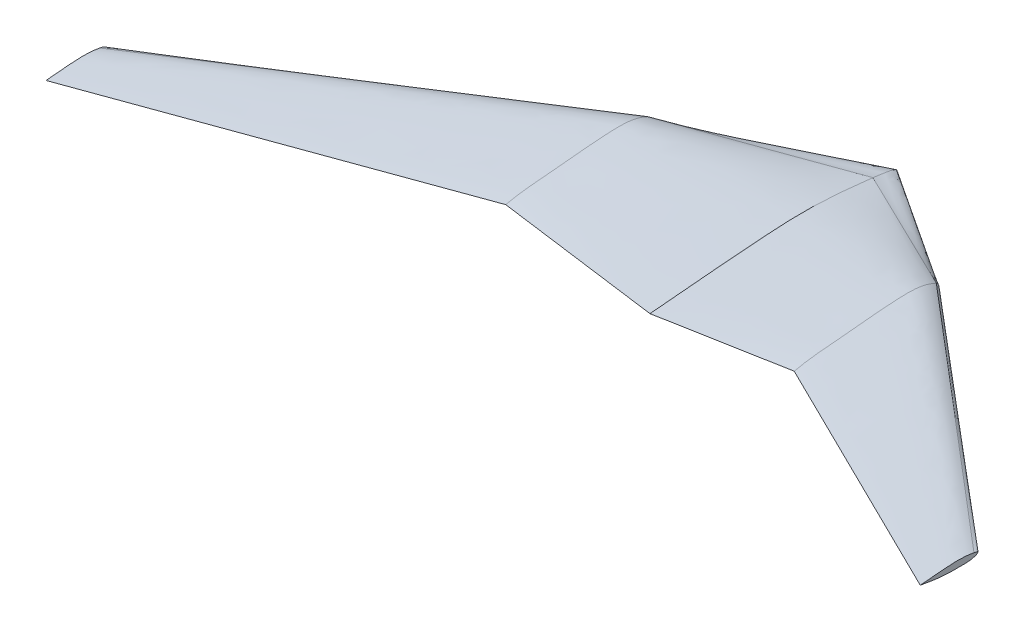
ISO-10303-21;
HEADER;
FILE_DESCRIPTION(('STEP AP214'),'2;1');
FILE_NAME('part.step','',(''),(''),'','','');
FILE_SCHEMA(('AUTOMOTIVE_DESIGN { 1 0 10303 214 1 1 1 1 }'));
ENDSEC;
DATA;
#1=APPLICATION_CONTEXT('core data for automotive mechanical design processes');
#2=APPLICATION_PROTOCOL_DEFINITION('international standard','automotive_design',2000,#1);
#3=PRODUCT_CONTEXT('',#1,'mechanical');
#4=PRODUCT('Part','Part','',(#3));
#5=PRODUCT_RELATED_PRODUCT_CATEGORY('part','',(#4));
#6=PRODUCT_DEFINITION_FORMATION('','',#4);
#7=PRODUCT_DEFINITION_CONTEXT('part definition',#1,'design');
#8=PRODUCT_DEFINITION('design','',#6,#7);
#9=PRODUCT_DEFINITION_SHAPE('','',#8);
#10=(LENGTH_UNIT() NAMED_UNIT(*) SI_UNIT(.MILLI.,.METRE.));
#11=(NAMED_UNIT(*) PLANE_ANGLE_UNIT() SI_UNIT($,.RADIAN.));
#12=(NAMED_UNIT(*) SI_UNIT($,.STERADIAN.) SOLID_ANGLE_UNIT());
#13=UNCERTAINTY_MEASURE_WITH_UNIT(LENGTH_MEASURE(1.E-05),#10,'distance_accuracy_value','');
#14=(GEOMETRIC_REPRESENTATION_CONTEXT(3) GLOBAL_UNCERTAINTY_ASSIGNED_CONTEXT((#13)) GLOBAL_UNIT_ASSIGNED_CONTEXT((#10,
#11,#12)) REPRESENTATION_CONTEXT('',''));
#15=CARTESIAN_POINT('',(0.,0.,0.));
#16=DIRECTION('',(0.,0.,1.));
#17=DIRECTION('',(1.,0.,0.));
#18=AXIS2_PLACEMENT_3D('',#15,#16,#17);
#19=CARTESIAN_POINT('',(0.,313.212123456196,-845.794606371427));
#20=CARTESIAN_POINT('',(-7141.464,1355.15127233936,3154.16521625914));
#21=CARTESIAN_POINT('',(0.,254.25800912972,-1113.28251415035));
#22=CARTESIAN_POINT('',(-7141.464,1308.32742979763,3091.94500858441));
#23=CARTESIAN_POINT('',(0.,241.600551235325,-1444.07983695447));
#24=CARTESIAN_POINT('',(-7141.464,1241.36244583985,3042.16322841744));
#25=CARTESIAN_POINT('',(0.,160.072055200291,-1796.93225186855));
#26=CARTESIAN_POINT('',(-7141.464,1155.46028035585,3022.34381843327));
#27=CARTESIAN_POINT('',(0.,107.719854446227,-1937.97637718965));
#28=CARTESIAN_POINT('',(-7141.464,1117.61849764473,3017.77159912219));
#29=CARTESIAN_POINT('',(0.,80.8373200384353,-2036.15116761756));
#30=CARTESIAN_POINT('',(-7141.464,1093.46910913496,3017.46976335433));
#31=CARTESIAN_POINT('',(0.,0.,-2044.85880049029));
#32=CARTESIAN_POINT('',(-7141.464,1076.1900662028,3018.47092959704));
#33=B_SPLINE_SURFACE_WITH_KNOTS('',3,1,((#19,#20),(#21,#22),(#23,#24),(#25,#26),(#27,#28),(#29,
#30),(#31,#32)),.UNSPECIFIED.,.F.,.F.,.F.,(4,1,1,1,4),(2,2),(0.,0.641389357026366,
0.78028809016673,0.847048003208916,1.),(0.,1.),.UNSPECIFIED.);
#34=CARTESIAN_POINT('',(0.,0.,-2044.85880049029));
#35=CARTESIAN_POINT('',(0.,80.8373200384353,-2036.15116761756));
#36=CARTESIAN_POINT('',(0.,107.719854446227,-1937.97637718965));
#37=CARTESIAN_POINT('',(0.,160.072055200291,-1796.93225186855));
#38=CARTESIAN_POINT('',(0.,241.600551235325,-1444.07983695447));
#39=CARTESIAN_POINT('',(0.,254.25800912972,-1113.28251415035));
#40=CARTESIAN_POINT('',(0.,313.212123456196,-845.794606371427));
#41=B_SPLINE_CURVE_WITH_KNOTS('',3,(#34,#35,#36,#37,#38,#39,#40),.UNSPECIFIED.,.F.,.F.,(4,1,1,1,
4),(0.,0.152951996791084,0.21971190983327,0.358610642973634,1.),.UNSPECIFIED.);
#42=CARTESIAN_POINT('',(0.,0.,-2044.85880049029));
#43=VERTEX_POINT('',#42);
#44=CARTESIAN_POINT('',(0.,313.212123456196,-845.794606371427));
#45=VERTEX_POINT('',#44);
#46=EDGE_CURVE('E152',#43,#45,#41,.T.);
#47=DIRECTION('',(-0.80967105594852,0.122014190270192,0.574060378820833));
#48=VECTOR('',#47,1.);
#49=CARTESIAN_POINT('',(-3570.732,538.095033101399,486.806064553379));
#50=LINE('',#49,#48);
#51=CARTESIAN_POINT('',(-7141.464,1076.1900662028,3018.47092959704));
#52=VERTEX_POINT('',#51);
#53=EDGE_CURVE('E360',#43,#52,#50,.T.);
#54=CARTESIAN_POINT('',(-7141.464,1076.1900662028,3018.47092959704));
#55=CARTESIAN_POINT('',(-7141.464,1245.64561396951,3008.65249377681));
#56=CARTESIAN_POINT('',(-7141.464,1355.15127233936,3154.16521625914));
#57=B_SPLINE_CURVE_WITH_KNOTS('',2,(#54,#55,#56),.UNSPECIFIED.,.F.,.F.,(3,3),(0.,1.),.UNSPECIFIED.);
#58=CARTESIAN_POINT('',(-7141.464,1355.15127233936,3154.16521625914));
#59=VERTEX_POINT('',#58);
#60=EDGE_CURVE('E14',#52,#59,#57,.T.);
#61=DIRECTION('',(0.865483719587218,-0.126274020307172,-0.484760562468667));
#62=VECTOR('',#61,1.);
#63=CARTESIAN_POINT('',(-3570.732,834.181697897776,1154.18530494386));
#64=LINE('',#63,#62);
#65=EDGE_CURVE('E363',#59,#45,#64,.T.);
#66=ORIENTED_EDGE('',*,*,#46,.F.);
#67=ORIENTED_EDGE('',*,*,#53,.T.);
#68=ORIENTED_EDGE('',*,*,#60,.T.);
#69=ORIENTED_EDGE('',*,*,#65,.T.);
#70=EDGE_LOOP('',(#66,#67,#68,#69));
#71=FACE_BOUND('',#70,.T.);
#72=ADVANCED_FACE('F122',(#71),#33,.T.);
#73=CARTESIAN_POINT('',(0.,0.,-2044.85880049029));
#74=CARTESIAN_POINT('',(-7141.464,1076.1900662028,3018.47092959704));
#75=CARTESIAN_POINT('',(0.,-107.279204192389,-1997.55905041334));
#76=CARTESIAN_POINT('',(-7141.464,1015.35728316744,3043.1137042829));
#77=CARTESIAN_POINT('',(0.,-258.362503233018,-1863.3626513076));
#78=CARTESIAN_POINT('',(-7141.464,939.946801510248,3142.59669084429));
#79=CARTESIAN_POINT('',(0.,-368.90983604449,-1658.21413589597));
#80=CARTESIAN_POINT('',(-7141.464,886.118601561279,3264.21736668196));
#81=CARTESIAN_POINT('',(0.,-506.319466477484,-1336.93402082316));
#82=CARTESIAN_POINT('',(-7141.464,819.838642969861,3452.17802628634));
#83=CARTESIAN_POINT('',(0.,-588.883001922082,-1041.95389300718));
#84=CARTESIAN_POINT('',(-7141.464,786.083730050734,3629.47816038486));
#85=CARTESIAN_POINT('',(0.,-673.671607155653,-611.496062460539));
#86=CARTESIAN_POINT('',(-7141.464,753.696560677085,3884.08751267283));
#87=CARTESIAN_POINT('',(0.,-751.771345989194,-85.1163969765674));
#88=CARTESIAN_POINT('',(-7141.464,727.684384284046,4192.79693831139));
#89=CARTESIAN_POINT('',(0.,-785.754141929436,421.610589056973));
#90=CARTESIAN_POINT('',(-7141.464,720.269455617635,4487.65263044262));
#91=CARTESIAN_POINT('',(0.,-862.06375951156,2177.32323225296));
#92=CARTESIAN_POINT('',(-7141.464,705.103131717681,5509.0822081433));
#93=CARTESIAN_POINT('',(0.,-728.345274210464,5351.61725098514));
#94=CARTESIAN_POINT('',(-7141.464,756.475026711885,7360.71764073963));
#95=CARTESIAN_POINT('',(0.,-421.850194823267,8495.7389316115));
#96=CARTESIAN_POINT('',(-7141.464,955.934990376717,9186.61343902675));
#97=CARTESIAN_POINT('',(0.,0.,10190.4900006633));
#98=CARTESIAN_POINT('',(-7141.464,1103.03602541015,10190.4900006633));
#99=B_SPLINE_SURFACE_WITH_KNOTS('',3,1,((#73,#74),(#75,#76),(#77,#78),(#79,#80),(#81,#82),(#83,
#84),(#85,#86),(#87,#88),(#89,#90),(#91,#92),(#93,#94),(#95,#96),(#97,#98)),.UNSPECIFIED.,.F.,
.F.,.F.,(4,1,1,1,1,1,1,1,1,1,4),(2,2),(0.,0.0266036602644848,0.0487246348972473,
0.0550800936828517,0.109102866154715,0.122243360149735,0.16065456835331,0.237026498440602,
0.243739291152606,0.581533392623739,1.),(0.,1.),.UNSPECIFIED.);
#100=CARTESIAN_POINT('',(0.,0.,10190.4900006633));
#101=CARTESIAN_POINT('',(0.,-421.850194823267,8495.7389316115));
#102=CARTESIAN_POINT('',(0.,-728.345274210464,5351.61725098514));
#103=CARTESIAN_POINT('',(0.,-882.180614630369,1699.77659585822));
#104=CARTESIAN_POINT('',(0.,-724.185413172541,-498.293673451026));
#105=CARTESIAN_POINT('',(0.,-479.240452624592,-1482.50991764024));
#106=CARTESIAN_POINT('',(0.,-222.110362198049,-1946.92961933578));
#107=CARTESIAN_POINT('',(0.,0.,-2044.85880049029));
#108=B_SPLINE_CURVE_WITH_KNOTS('',3,(#100,#101,#102,#103,#104,#105,#106,#107),.UNSPECIFIED.,.F.,
.F.,(4,1,1,1,1,4),(0.,0.418466607376261,0.756260708847394,0.877756639850265,0.944919906317148,
1.),.UNSPECIFIED.);
#109=CARTESIAN_POINT('',(0.,0.,10190.4900006633));
#110=VERTEX_POINT('',#109);
#111=EDGE_CURVE('E381',#110,#43,#108,.T.);
#112=DIRECTION('',(-0.988281067167792,0.152645118748321,0.));
#113=VECTOR('',#112,1.);
#114=CARTESIAN_POINT('',(-3570.732,551.518012705074,10190.4900006633));
#115=LINE('',#114,#113);
#116=CARTESIAN_POINT('',(-7141.464,1103.03602541015,10190.4900006633));
#117=VERTEX_POINT('',#116);
#118=EDGE_CURVE('E351',#110,#117,#115,.T.);
#119=CARTESIAN_POINT('',(-7141.464,1103.03602541015,10190.4900006633));
#120=CARTESIAN_POINT('',(-7141.464,834.832565912711,8360.16184098633));
#121=CARTESIAN_POINT('',(-7141.464,674.114665387005,6323.0044228708));
#122=CARTESIAN_POINT('',(-7141.464,728.486352093257,4160.90657441306));
#123=CARTESIAN_POINT('',(-7141.464,769.843726768116,3706.78460174212));
#124=CARTESIAN_POINT('',(-7141.464,833.323691386344,3383.5034037843));
#125=CARTESIAN_POINT('',(-7141.464,939.946801510248,3142.59669084429));
#126=CARTESIAN_POINT('',(-7141.464,1015.35728316744,3043.1137042829));
#127=CARTESIAN_POINT('',(-7141.464,1076.1900662028,3018.47092959704));
#128=B_SPLINE_CURVE_WITH_KNOTS('',3,(#119,#120,#121,#122,#123,#124,#125,#126,#127),
.UNSPECIFIED.,.F.,.F.,(4,1,1,1,1,1,4),(0.,0.762973501559398,0.83934543164669,0.890897133845285,
0.951275365102753,0.973396339735515,1.),.UNSPECIFIED.);
#129=EDGE_CURVE('E359',#117,#52,#128,.T.);
#130=ORIENTED_EDGE('',*,*,#111,.F.);
#131=ORIENTED_EDGE('',*,*,#118,.T.);
#132=ORIENTED_EDGE('',*,*,#129,.T.);
#133=ORIENTED_EDGE('',*,*,#53,.F.);
#134=EDGE_LOOP('',(#130,#131,#132,#133));
#135=FACE_BOUND('',#134,.T.);
#136=ADVANCED_FACE('F386',(#135),#99,.T.);
#137=CARTESIAN_POINT('',(0.,0.,10190.4900006633));
#138=CARTESIAN_POINT('',(-7141.464,1103.03602541015,10190.4900006633));
#139=CARTESIAN_POINT('',(0.,130.451901567589,8896.85057805683));
#140=CARTESIAN_POINT('',(-7141.464,1292.0278635339,9372.97604436865));
#141=CARTESIAN_POINT('',(0.,274.597101503149,7196.00626101595));
#142=CARTESIAN_POINT('',(-7141.464,1342.56205259086,8277.21188727556));
#143=CARTESIAN_POINT('',(0.,418.579425335718,5323.22341392266));
#144=CARTESIAN_POINT('',(-7141.464,1473.42100320087,7078.04650816974));
#145=CARTESIAN_POINT('',(0.,508.8226926825,4130.01125667367));
#146=CARTESIAN_POINT('',(-7141.464,1550.01984762799,6315.18574045972));
#147=CARTESIAN_POINT('',(0.,555.913438226822,3341.23849276092));
#148=CARTESIAN_POINT('',(-7141.464,1585.96283572307,5811.79683119407));
#149=CARTESIAN_POINT('',(0.,567.667962681533,1530.2140809634));
#150=CARTESIAN_POINT('',(-7141.464,1664.51611564085,4644.66284815805));
#151=CARTESIAN_POINT('',(0.,453.377873639326,334.758172691442));
#152=CARTESIAN_POINT('',(-7141.464,1711.43414184969,3859.76386982339));
#153=CARTESIAN_POINT('',(0.,313.212123456196,-845.794606371427));
#154=CARTESIAN_POINT('',(-7141.464,1355.15127233936,3154.16521625914));
#155=B_SPLINE_SURFACE_WITH_KNOTS('',3,1,((#137,#138),(#139,#140),(#141,#142),(#143,#144),(#145,
#146),(#147,#148),(#149,#150),(#151,#152),(#153,#154)),.UNSPECIFIED.,.F.,.F.,.F.,(4,1,1,1,1,1,
4),(2,2),(0.,0.352294856923254,0.462919943049264,0.508952403604229,0.67637547058738,
0.676970170033051,1.),(0.,1.),.UNSPECIFIED.);
#156=CARTESIAN_POINT('',(0.,313.212123456196,-845.794606371427));
#157=CARTESIAN_POINT('',(0.,453.635919448732,336.93157594453));
#158=CARTESIAN_POINT('',(0.,643.229358172172,2320.92245325584));
#159=CARTESIAN_POINT('',(0.,369.515228470284,6005.06390246833));
#160=CARTESIAN_POINT('',(0.,171.415465362562,8490.63127133268));
#161=CARTESIAN_POINT('',(0.,0.,10190.4900006633));
#162=B_SPLINE_CURVE_WITH_KNOTS('',3,(#156,#157,#158,#159,#160,#161),.UNSPECIFIED.,.F.,.F.,(4,1,
1,4),(0.,0.32362452941262,0.537080056950736,1.),.UNSPECIFIED.);
#163=EDGE_CURVE('E225',#45,#110,#162,.T.);
#164=CARTESIAN_POINT('',(-7141.464,1355.15127233936,3154.16521625914));
#165=CARTESIAN_POINT('',(-7141.464,1711.43414184969,3859.76386982339));
#166=CARTESIAN_POINT('',(-7141.464,1640.24366676642,5050.72043119492));
#167=CARTESIAN_POINT('',(-7141.464,1531.6055066706,6573.94581663927));
#168=CARTESIAN_POINT('',(-7141.464,1347.5871397563,8168.24980625853));
#169=CARTESIAN_POINT('',(-7141.464,1292.0278635339,9372.97604436865));
#170=CARTESIAN_POINT('',(-7141.464,1103.03602541015,10190.4900006633));
#171=B_SPLINE_CURVE_WITH_KNOTS('',3,(#164,#165,#166,#167,#168,#169,#170),.UNSPECIFIED.,.F.,.F.,
(4,1,1,1,4),(0.,0.323029829966949,0.491047596395771,0.647705143076746,1.),.UNSPECIFIED.);
#172=EDGE_CURVE('E136',#59,#117,#171,.T.);
#173=ORIENTED_EDGE('',*,*,#163,.F.);
#174=ORIENTED_EDGE('',*,*,#65,.F.);
#175=ORIENTED_EDGE('',*,*,#172,.T.);
#176=ORIENTED_EDGE('',*,*,#118,.F.);
#177=EDGE_LOOP('',(#173,#174,#175,#176));
#178=FACE_BOUND('',#177,.T.);
#179=ADVANCED_FACE('F124',(#178),#155,.T.);
#180=CARTESIAN_POINT('',(-21640.8,3329.51833065238,15608.8420788761));
#181=DIRECTION('',(1.,0.,0.));
#182=DIRECTION('',(0.,0.,-1.));
#183=AXIS2_PLACEMENT_3D('',#180,#181,#182);
#184=PLANE('',#183);
#185=CARTESIAN_POINT('',(-21640.8,3307.78002261634,15591.7740743346));
#186=CARTESIAN_POINT('',(-21640.8,3322.40571316473,15588.7686747126));
#187=CARTESIAN_POINT('',(-21640.8,3330.65683270265,15574.4006286301));
#188=CARTESIAN_POINT('',(-21640.8,3369.17898500054,15789.4546466456));
#189=B_SPLINE_CURVE_WITH_KNOTS('',3,(#185,#186,#187,#188),.UNSPECIFIED.,.F.,.F.,(4,4),(0.,1.),.UNSPECIFIED.);
#190=CARTESIAN_POINT('',(-21640.8,3307.78002261634,15591.7740743346));
#191=VERTEX_POINT('',#190);
#192=CARTESIAN_POINT('',(-21640.8,3369.17898500054,15789.4546466456));
#193=VERTEX_POINT('',#192);
#194=EDGE_CURVE('E273',#191,#193,#189,.T.);
#195=ORIENTED_EDGE('',*,*,#194,.F.);
#196=CARTESIAN_POINT('',(-21640.8,3306.52516238741,18449.2737988011));
#197=CARTESIAN_POINT('',(-21640.8,3175.30356352501,17849.4129804002));
#198=CARTESIAN_POINT('',(-21640.8,3106.39103189736,17099.4447161359));
#199=CARTESIAN_POINT('',(-21640.8,3118.0373355716,16284.6771052251));
#200=CARTESIAN_POINT('',(-21640.8,3134.75942232382,16002.5177241358));
#201=CARTESIAN_POINT('',(-21640.8,3177.96273601475,15784.3785623033));
#202=CARTESIAN_POINT('',(-21640.8,3230.20631727869,15630.9629444655));
#203=CARTESIAN_POINT('',(-21640.8,3307.78002261634,15591.7740743346));
#204=B_SPLINE_CURVE_WITH_KNOTS('',3,(#196,#197,#198,#199,#200,#201,#202,#203),.UNSPECIFIED.,.F.,
.F.,(4,1,1,1,1,4),(0.,0.629941045605283,0.770304939868221,0.838569921330946,0.919828565294607,
1.),.UNSPECIFIED.);
#205=CARTESIAN_POINT('',(-21640.8,3306.52516238741,18449.2737988011));
#206=VERTEX_POINT('',#205);
#207=EDGE_CURVE('E602',#206,#191,#204,.T.);
#208=ORIENTED_EDGE('',*,*,#207,.F.);
#209=CARTESIAN_POINT('',(-21640.8,3369.17898500054,15789.4546466456));
#210=CARTESIAN_POINT('',(-21640.8,3483.82081037333,16329.3503113947));
#211=CARTESIAN_POINT('',(-21640.8,3411.78431179898,17217.5226327978));
#212=CARTESIAN_POINT('',(-21640.8,3346.08810156237,18103.7745001314));
#213=CARTESIAN_POINT('',(-21640.8,3306.52516238741,18449.2737988011));
#214=B_SPLINE_CURVE_WITH_KNOTS('',3,(#209,#210,#211,#212,#213),.UNSPECIFIED.,.F.,.F.,(4,1,4),
(0.,0.609039002756986,1.),.UNSPECIFIED.);
#215=EDGE_CURVE('E280',#193,#206,#214,.T.);
#216=ORIENTED_EDGE('',*,*,#215,.F.);
#217=EDGE_LOOP('',(#195,#208,#216));
#218=FACE_BOUND('',#217,.T.);
#219=ADVANCED_FACE('F305',(#218),#184,.F.);
#220=CARTESIAN_POINT('',(-7141.464,1355.15127233936,3154.16521625914));
#221=CARTESIAN_POINT('',(-21640.8,3369.17898500054,15789.4546466456));
#222=CARTESIAN_POINT('',(-7141.464,1330.29937481006,3121.14165088204));
#223=CARTESIAN_POINT('',(-21640.8,3364.83467200451,15765.202056653));
#224=CARTESIAN_POINT('',(-7141.464,1289.07643378533,3080.13767107166));
#225=CARTESIAN_POINT('',(-21640.7999999999,3358.06519777707,15728.4329710065));
#226=CARTESIAN_POINT('',(-7141.464,1230.0347019717,3045.65549360096));
#227=CARTESIAN_POINT('',(-21640.8,3348.66002962273,15681.9608363358));
#228=CARTESIAN_POINT('',(-7141.464,1189.51856686121,3030.38241969995));
#229=CARTESIAN_POINT('',(-21640.8,3342.05136374861,15652.2703704032));
#230=CARTESIAN_POINT('',(-7141.464,1160.43090755498,3023.57486650839));
#231=CARTESIAN_POINT('',(-21640.7999999999,3336.93653668989,15632.1218117428));
#232=CARTESIAN_POINT('',(-7141.464,1141.37508332317,3020.64846553958));
#233=CARTESIAN_POINT('',(-21640.8000000001,3333.1875701504,15619.4348213881));
#234=CARTESIAN_POINT('',(-7141.464,1130.00013978758,3019.35686297448));
#235=CARTESIAN_POINT('',(-21640.8,3330.74305370598,15612.0465742609));
#236=CARTESIAN_POINT('',(-7141.464,1119.4910265371,3018.50538163976));
#237=CARTESIAN_POINT('',(-21640.8,3328.23398082707,15605.3998419544));
#238=CARTESIAN_POINT('',(-7141.464,1110.65831480276,3018.06814680114));
#239=CARTESIAN_POINT('',(-21640.8000000001,3325.78606259492,15600.0239267143));
#240=CARTESIAN_POINT('',(-7141.464,1103.52651757087,3017.89125298996));
#241=CARTESIAN_POINT('',(-21640.8,3323.34750867157,15595.9764965101));
#242=CARTESIAN_POINT('',(-7141.464,1098.82030055717,3017.84498153399));
#243=CARTESIAN_POINT('',(-21640.8,3321.42173551372,15593.5414953637));
#244=CARTESIAN_POINT('',(-7141.464,1094.86758459254,3017.85304380109));
#245=CARTESIAN_POINT('',(-21640.8,3319.47501055568,15591.8153004194));
#246=CARTESIAN_POINT('',(-7141.464,1091.57748312109,3017.89315552731));
#247=CARTESIAN_POINT('',(-21640.8,3317.55175633703,15590.81540956));
#248=CARTESIAN_POINT('',(-7141.464,1088.47628601635,3017.95736105464));
#249=CARTESIAN_POINT('',(-21640.8000000001,3315.5649688729,15590.3962982106));
#250=CARTESIAN_POINT('',(-7141.464,1085.33803101803,3018.04736269133));
#251=CARTESIAN_POINT('',(-21640.7999999999,3313.52050298673,15590.4549096));
#252=CARTESIAN_POINT('',(-7141.464,1081.18942213383,3018.20467135525));
#253=CARTESIAN_POINT('',(-21640.8,3310.89144736036,15590.9916930219));
#254=CARTESIAN_POINT('',(-7141.464,1078.08662544662,3018.36104092441));
#255=CARTESIAN_POINT('',(-21640.8,3308.9702609395,15591.5294949902));
#256=CARTESIAN_POINT('',(-7141.464,1076.1900662028,3018.47092959704));
#257=CARTESIAN_POINT('',(-21640.8,3307.78002261634,15591.7740743346));
#258=B_SPLINE_SURFACE_WITH_KNOTS('',3,1,((#220,#221),(#222,#223),(#224,#225),(#226,#227),(#228,
#229),(#230,#231),(#232,#233),(#234,#235),(#236,#237),(#238,#239),(#240,#241),(#242,#243),(#244,
#245),(#246,#247),(#248,#249),(#250,#251),(#252,#253),(#254,#255),(#256,#257)),.UNSPECIFIED.,
.F.,.F.,.F.,(4,1,1,1,1,1,1,1,1,1,1,1,1,1,1,1,4),(2,2),(0.,0.340419361418228,0.516536307601035,
0.655083408860316,0.760638873715297,0.803695423936835,0.837847970285394,0.868145180713847,
0.901824184343303,0.919350404068745,0.933337164079811,0.944597640851327,0.955111524310967,
0.962986739977469,0.972452613300727,0.983211887110114,1.),(0.,1.),.UNSPECIFIED.);
#259=DIRECTION('',(-0.750446749902145,0.115501111906422,0.650760454168574));
#260=VECTOR('',#259,1.);
#261=CARTESIAN_POINT('',(-14391.132,2191.98504440957,9305.12250196585));
#262=LINE('',#261,#260);
#263=EDGE_CURVE('E264',#52,#191,#262,.T.);
#264=DIRECTION('',(0.749805378052953,-0.104151583941571,-0.653409781534781));
#265=VECTOR('',#264,1.);
#266=CARTESIAN_POINT('',(-14391.132,2362.16512866995,9471.80993145237));
#267=LINE('',#266,#265);
#268=EDGE_CURVE('E144',#193,#59,#267,.T.);
#269=ORIENTED_EDGE('',*,*,#60,.F.);
#270=ORIENTED_EDGE('',*,*,#263,.T.);
#271=ORIENTED_EDGE('',*,*,#194,.T.);
#272=ORIENTED_EDGE('',*,*,#268,.T.);
#273=EDGE_LOOP('',(#269,#270,#271,#272));
#274=FACE_BOUND('',#273,.T.);
#275=ADVANCED_FACE('F314',(#274),#258,.T.);
#276=CARTESIAN_POINT('',(-7141.464,1076.1900662028,3018.47092959704));
#277=CARTESIAN_POINT('',(-21640.8,3307.78002261634,15591.7740743346));
#278=CARTESIAN_POINT('',(-7141.464,1015.35728316744,3043.1137042829));
#279=CARTESIAN_POINT('',(-21640.8,3282.03837897676,15604.7782994797));
#280=CARTESIAN_POINT('',(-7141.464,939.946801510248,3142.59669084429));
#281=CARTESIAN_POINT('',(-21640.8,3245.30454011544,15636.0579725111));
#282=CARTESIAN_POINT('',(-7141.464,861.597551736528,3319.62079192677));
#283=CARTESIAN_POINT('',(-21640.8,3206.9161978979,15702.5461183919));
#284=CARTESIAN_POINT('',(-7141.464,807.956609024374,3512.68905825011));
#285=CARTESIAN_POINT('',(-21640.8,3183.59205480835,15780.9330042735));
#286=CARTESIAN_POINT('',(-7141.464,762.936959848673,3782.6239083445));
#287=CARTESIAN_POINT('',(-21640.8,3157.62152990673,15887.2558305599));
#288=CARTESIAN_POINT('',(-7141.464,745.089849253284,3978.59294974938));
#289=CARTESIAN_POINT('',(-21640.8,3144.33429510366,15964.794845412));
#290=CARTESIAN_POINT('',(-7141.464,726.427397819519,4270.17167272126));
#291=CARTESIAN_POINT('',(-21640.8,3130.11677353234,16080.8552503686));
#292=CARTESIAN_POINT('',(-7141.464,721.095356699617,4455.45108893885));
#293=CARTESIAN_POINT('',(-21640.8,3125.71127845714,16155.1911740024));
#294=CARTESIAN_POINT('',(-7141.464,712.695960688604,4961.77118854683));
#295=CARTESIAN_POINT('',(-21640.8,3116.9874304427,16358.1277654073));
#296=CARTESIAN_POINT('',(-7141.464,714.21142652553,6831.24534767487));
#297=CARTESIAN_POINT('',(-21640.8,3107.04691237818,17106.5825985231));
#298=CARTESIAN_POINT('',(-7141.464,881.596660392284,8679.2988094212));
#299=CARTESIAN_POINT('',(-21640.8,3175.30356352501,17849.4129804002));
#300=CARTESIAN_POINT('',(-7141.464,1103.03602541015,10190.4900006633));
#301=CARTESIAN_POINT('',(-21640.8,3306.52516238741,18449.2737988011));
#302=B_SPLINE_SURFACE_WITH_KNOTS('',3,1,((#276,#277),(#278,#279),(#280,#281),(#282,#283),(#284,
#285),(#286,#287),(#288,#289),(#290,#291),(#292,#293),(#294,#295),(#296,#297),(#298,#299),(#300,
#301)),.UNSPECIFIED.,.F.,.F.,.F.,(4,1,1,1,1,1,1,1,1,1,4),(2,2),(0.,0.0266036602644848,
0.0487246348972473,0.0801714347053929,0.109102866154715,0.16065456835331,0.161430078669054,
0.229695060131779,0.237026498440602,0.370058954394717,1.),(0.,1.),.UNSPECIFIED.);
#303=DIRECTION('',(-0.861449291485047,0.130915936829387,0.490679259480156));
#304=VECTOR('',#303,1.);
#305=CARTESIAN_POINT('',(-14391.132,2204.78059389878,14319.8818997322));
#306=LINE('',#305,#304);
#307=EDGE_CURVE('E269',#117,#206,#306,.T.);
#308=ORIENTED_EDGE('',*,*,#129,.F.);
#309=ORIENTED_EDGE('',*,*,#307,.T.);
#310=ORIENTED_EDGE('',*,*,#207,.T.);
#311=ORIENTED_EDGE('',*,*,#263,.F.);
#312=EDGE_LOOP('',(#308,#309,#310,#311));
#313=FACE_BOUND('',#312,.T.);
#314=ADVANCED_FACE('F300',(#313),#302,.T.);
#315=CARTESIAN_POINT('',(-7141.464,1103.03602541015,10190.4900006633));
#316=CARTESIAN_POINT('',(-21640.8,3306.52516238741,18449.2737988011));
#317=CARTESIAN_POINT('',(-7141.464,1292.0278635339,9372.97604436865));
#318=CARTESIAN_POINT('',(-21640.8,3342.17531699207,18137.9444671024));
#319=CARTESIAN_POINT('',(-7141.464,1334.70672679142,8447.5437875979));
#320=CARTESIAN_POINT('',(-21640.8,3369.23253854807,17791.5525253311));
#321=CARTESIAN_POINT('',(-7141.464,1453.86066172897,7247.51399649659));
#322=CARTESIAN_POINT('',(-21640.8,3403.8056046871,17340.1481673144));
#323=CARTESIAN_POINT('',(-7141.464,1538.09089340444,6483.01362763049));
#324=CARTESIAN_POINT('',(-21640.8,3426.18323870349,17052.0867207418));
#325=CARTESIAN_POINT('',(-7141.464,1640.24366676642,5050.72043119492));
#326=CARTESIAN_POINT('',(-21640.8,3454.62907080609,16511.5540108215));
#327=CARTESIAN_POINT('',(-7141.464,1711.43414184969,3859.76386982339));
#328=CARTESIAN_POINT('',(-21640.8,3429.98417020154,16075.8113561409));
#329=CARTESIAN_POINT('',(-7141.464,1355.15127233936,3154.16521625914));
#330=CARTESIAN_POINT('',(-21640.8,3369.17898500054,15789.4546466456));
#331=B_SPLINE_SURFACE_WITH_KNOTS('',3,1,((#315,#316),(#317,#318),(#319,#320),(#321,#322),(#323,
#324),(#325,#326),(#327,#328),(#329,#330)),.UNSPECIFIED.,.F.,.F.,.F.,(4,1,1,1,1,4),(2,2),(0.,
0.352294856923254,0.390960997243014,0.508952403604229,0.676970170033051,1.),(0.,1.),.UNSPECIFIED.);
#332=ORIENTED_EDGE('',*,*,#172,.F.);
#333=ORIENTED_EDGE('',*,*,#268,.F.);
#334=ORIENTED_EDGE('',*,*,#215,.T.);
#335=ORIENTED_EDGE('',*,*,#307,.F.);
#336=EDGE_LOOP('',(#332,#333,#334,#335));
#337=FACE_BOUND('',#336,.T.);
#338=ADVANCED_FACE('F287',(#337),#331,.T.);
#339=CARTESIAN_POINT('',(0.,313.212123456196,-845.794606371427));
#340=CARTESIAN_POINT('',(7141.464,1355.15127233936,3154.16521625914));
#341=CARTESIAN_POINT('',(0.,254.25800912972,-1113.28251415035));
#342=CARTESIAN_POINT('',(7141.464,1308.32742979763,3091.94500858441));
#343=CARTESIAN_POINT('',(0.,241.600551235325,-1444.07983695447));
#344=CARTESIAN_POINT('',(7141.464,1241.36244583985,3042.16322841744));
#345=CARTESIAN_POINT('',(0.,160.072055200291,-1796.93225186855));
#346=CARTESIAN_POINT('',(7141.464,1155.46028035585,3022.34381843327));
#347=CARTESIAN_POINT('',(0.,107.719854446227,-1937.97637718965));
#348=CARTESIAN_POINT('',(7141.464,1117.61849764473,3017.77159912219));
#349=CARTESIAN_POINT('',(0.,80.8373200384353,-2036.15116761756));
#350=CARTESIAN_POINT('',(7141.464,1093.46910913496,3017.46976335433));
#351=CARTESIAN_POINT('',(0.,0.,-2044.85880049029));
#352=CARTESIAN_POINT('',(7141.464,1076.1900662028,3018.47092959704));
#353=B_SPLINE_SURFACE_WITH_KNOTS('',3,1,((#339,#340),(#341,#342),(#343,#344),(#345,#346),(#347,
#348),(#349,#350),(#351,#352)),.UNSPECIFIED.,.F.,.F.,.F.,(4,1,1,1,4),(2,2),(0.,
0.641389357026366,0.78028809016673,0.847048003208916,1.),(0.,1.),.UNSPECIFIED.);
#354=DIRECTION('',(-0.865483719587218,-0.126274020307172,-0.484760562468667));
#355=VECTOR('',#354,1.);
#356=CARTESIAN_POINT('',(3570.732,834.181697897776,1154.18530494386));
#357=LINE('',#356,#355);
#358=CARTESIAN_POINT('',(7141.464,1355.15127233936,3154.16521625914));
#359=VERTEX_POINT('',#358);
#360=EDGE_CURVE('E637',#359,#45,#357,.T.);
#361=CARTESIAN_POINT('',(7141.464,1076.1900662028,3018.47092959704));
#362=CARTESIAN_POINT('',(7141.464,1245.64561396951,3008.65249377681));
#363=CARTESIAN_POINT('',(7141.464,1355.15127233936,3154.16521625914));
#364=B_SPLINE_CURVE_WITH_KNOTS('',2,(#361,#362,#363),.UNSPECIFIED.,.F.,.F.,(3,3),(0.,1.),.UNSPECIFIED.);
#365=CARTESIAN_POINT('',(7141.464,1076.1900662028,3018.47092959704));
#366=VERTEX_POINT('',#365);
#367=EDGE_CURVE('E218',#366,#359,#364,.T.);
#368=DIRECTION('',(0.80967105594852,0.122014190270192,0.574060378820833));
#369=VECTOR('',#368,1.);
#370=CARTESIAN_POINT('',(3570.732,538.095033101399,486.806064553379));
#371=LINE('',#370,#369);
#372=EDGE_CURVE('E229',#43,#366,#371,.T.);
#373=ORIENTED_EDGE('',*,*,#46,.T.);
#374=ORIENTED_EDGE('',*,*,#360,.F.);
#375=ORIENTED_EDGE('',*,*,#367,.F.);
#376=ORIENTED_EDGE('',*,*,#372,.F.);
#377=EDGE_LOOP('',(#373,#374,#375,#376));
#378=FACE_BOUND('',#377,.T.);
#379=ADVANCED_FACE('F299',(#378),#353,.F.);
#380=CARTESIAN_POINT('',(0.,0.,-2044.85880049029));
#381=CARTESIAN_POINT('',(7141.464,1076.1900662028,3018.47092959704));
#382=CARTESIAN_POINT('',(0.,-107.279204192389,-1997.55905041334));
#383=CARTESIAN_POINT('',(7141.464,1015.35728316744,3043.1137042829));
#384=CARTESIAN_POINT('',(0.,-258.362503233018,-1863.3626513076));
#385=CARTESIAN_POINT('',(7141.464,939.946801510248,3142.59669084429));
#386=CARTESIAN_POINT('',(0.,-368.90983604449,-1658.21413589597));
#387=CARTESIAN_POINT('',(7141.464,886.118601561279,3264.21736668196));
#388=CARTESIAN_POINT('',(0.,-506.319466477484,-1336.93402082316));
#389=CARTESIAN_POINT('',(7141.464,819.838642969861,3452.17802628634));
#390=CARTESIAN_POINT('',(0.,-588.883001922082,-1041.95389300718));
#391=CARTESIAN_POINT('',(7141.464,786.083730050734,3629.47816038486));
#392=CARTESIAN_POINT('',(0.,-673.671607155653,-611.496062460539));
#393=CARTESIAN_POINT('',(7141.464,753.696560677085,3884.08751267283));
#394=CARTESIAN_POINT('',(0.,-751.771345989194,-85.1163969765674));
#395=CARTESIAN_POINT('',(7141.464,727.684384284046,4192.79693831139));
#396=CARTESIAN_POINT('',(0.,-785.754141929436,421.610589056973));
#397=CARTESIAN_POINT('',(7141.464,720.269455617635,4487.65263044262));
#398=CARTESIAN_POINT('',(0.,-862.06375951156,2177.32323225296));
#399=CARTESIAN_POINT('',(7141.464,705.103131717681,5509.0822081433));
#400=CARTESIAN_POINT('',(0.,-728.345274210464,5351.61725098514));
#401=CARTESIAN_POINT('',(7141.464,756.475026711885,7360.71764073963));
#402=CARTESIAN_POINT('',(0.,-421.850194823267,8495.7389316115));
#403=CARTESIAN_POINT('',(7141.464,955.934990376717,9186.61343902675));
#404=CARTESIAN_POINT('',(0.,0.,10190.4900006633));
#405=CARTESIAN_POINT('',(7141.464,1103.03602541015,10190.4900006633));
#406=B_SPLINE_SURFACE_WITH_KNOTS('',3,1,((#380,#381),(#382,#383),(#384,#385),(#386,#387),(#388,
#389),(#390,#391),(#392,#393),(#394,#395),(#396,#397),(#398,#399),(#400,#401),(#402,#403),(#404,
#405)),.UNSPECIFIED.,.F.,.F.,.F.,(4,1,1,1,1,1,1,1,1,1,4),(2,2),(0.,0.0266036602644848,
0.0487246348972473,0.0550800936828517,0.109102866154715,0.122243360149735,0.16065456835331,
0.237026498440602,0.243739291152606,0.581533392623739,1.),(0.,1.),.UNSPECIFIED.);
#407=CARTESIAN_POINT('',(7141.464,1103.03602541015,10190.4900006633));
#408=CARTESIAN_POINT('',(7141.464,834.832565912711,8360.16184098633));
#409=CARTESIAN_POINT('',(7141.464,674.114665387005,6323.0044228708));
#410=CARTESIAN_POINT('',(7141.464,728.486352093257,4160.90657441306));
#411=CARTESIAN_POINT('',(7141.464,769.843726768116,3706.78460174212));
#412=CARTESIAN_POINT('',(7141.464,833.323691386344,3383.5034037843));
#413=CARTESIAN_POINT('',(7141.464,939.946801510248,3142.59669084429));
#414=CARTESIAN_POINT('',(7141.464,1015.35728316744,3043.1137042829));
#415=CARTESIAN_POINT('',(7141.464,1076.1900662028,3018.47092959704));
#416=B_SPLINE_CURVE_WITH_KNOTS('',3,(#407,#408,#409,#410,#411,#412,#413,#414,#415),
.UNSPECIFIED.,.F.,.F.,(4,1,1,1,1,1,4),(0.,0.762973501559398,0.83934543164669,0.890897133845285,
0.951275365102753,0.973396339735515,1.),.UNSPECIFIED.);
#417=CARTESIAN_POINT('',(7141.464,1103.03602541015,10190.4900006633));
#418=VERTEX_POINT('',#417);
#419=EDGE_CURVE('E199',#418,#366,#416,.T.);
#420=DIRECTION('',(0.988281067167792,0.152645118748321,0.));
#421=VECTOR('',#420,1.);
#422=CARTESIAN_POINT('',(3570.732,551.518012705074,10190.4900006633));
#423=LINE('',#422,#421);
#424=EDGE_CURVE('E222',#110,#418,#423,.T.);
#425=ORIENTED_EDGE('',*,*,#111,.T.);
#426=ORIENTED_EDGE('',*,*,#372,.T.);
#427=ORIENTED_EDGE('',*,*,#419,.F.);
#428=ORIENTED_EDGE('',*,*,#424,.F.);
#429=EDGE_LOOP('',(#425,#426,#427,#428));
#430=FACE_BOUND('',#429,.T.);
#431=ADVANCED_FACE('F231',(#430),#406,.F.);
#432=CARTESIAN_POINT('',(0.,0.,10190.4900006633));
#433=CARTESIAN_POINT('',(7141.464,1103.03602541015,10190.4900006633));
#434=CARTESIAN_POINT('',(0.,130.451901567589,8896.85057805683));
#435=CARTESIAN_POINT('',(7141.464,1292.0278635339,9372.97604436865));
#436=CARTESIAN_POINT('',(0.,274.597101503149,7196.00626101595));
#437=CARTESIAN_POINT('',(7141.464,1342.56205259086,8277.21188727556));
#438=CARTESIAN_POINT('',(0.,418.579425335718,5323.22341392266));
#439=CARTESIAN_POINT('',(7141.464,1473.42100320087,7078.04650816974));
#440=CARTESIAN_POINT('',(0.,508.8226926825,4130.01125667367));
#441=CARTESIAN_POINT('',(7141.464,1550.01984762799,6315.18574045972));
#442=CARTESIAN_POINT('',(0.,555.913438226822,3341.23849276092));
#443=CARTESIAN_POINT('',(7141.464,1585.96283572307,5811.79683119407));
#444=CARTESIAN_POINT('',(0.,567.667962681533,1530.2140809634));
#445=CARTESIAN_POINT('',(7141.464,1664.51611564085,4644.66284815805));
#446=CARTESIAN_POINT('',(0.,453.377873639326,334.758172691442));
#447=CARTESIAN_POINT('',(7141.464,1711.43414184969,3859.76386982339));
#448=CARTESIAN_POINT('',(0.,313.212123456196,-845.794606371427));
#449=CARTESIAN_POINT('',(7141.464,1355.15127233936,3154.16521625914));
#450=B_SPLINE_SURFACE_WITH_KNOTS('',3,1,((#432,#433),(#434,#435),(#436,#437),(#438,#439),(#440,
#441),(#442,#443),(#444,#445),(#446,#447),(#448,#449)),.UNSPECIFIED.,.F.,.F.,.F.,(4,1,1,1,1,1,
4),(2,2),(0.,0.352294856923254,0.462919943049264,0.508952403604229,0.67637547058738,
0.676970170033051,1.),(0.,1.),.UNSPECIFIED.);
#451=CARTESIAN_POINT('',(7141.464,1355.15127233936,3154.16521625914));
#452=CARTESIAN_POINT('',(7141.464,1711.43414184969,3859.76386982339));
#453=CARTESIAN_POINT('',(7141.464,1640.24366676642,5050.72043119492));
#454=CARTESIAN_POINT('',(7141.464,1531.6055066706,6573.94581663927));
#455=CARTESIAN_POINT('',(7141.464,1347.5871397563,8168.24980625853));
#456=CARTESIAN_POINT('',(7141.464,1292.0278635339,9372.97604436865));
#457=CARTESIAN_POINT('',(7141.464,1103.03602541015,10190.4900006633));
#458=B_SPLINE_CURVE_WITH_KNOTS('',3,(#451,#452,#453,#454,#455,#456,#457),.UNSPECIFIED.,.F.,.F.,
(4,1,1,1,4),(0.,0.323029829966949,0.491047596395771,0.647705143076746,1.),.UNSPECIFIED.);
#459=EDGE_CURVE('E211',#359,#418,#458,.T.);
#460=ORIENTED_EDGE('',*,*,#163,.T.);
#461=ORIENTED_EDGE('',*,*,#424,.T.);
#462=ORIENTED_EDGE('',*,*,#459,.F.);
#463=ORIENTED_EDGE('',*,*,#360,.T.);
#464=EDGE_LOOP('',(#460,#461,#462,#463));
#465=FACE_BOUND('',#464,.T.);
#466=ADVANCED_FACE('F223',(#465),#450,.F.);
#467=CARTESIAN_POINT('',(21640.8,3329.51833065238,15608.8420788761));
#468=DIRECTION('',(-1.,0.,0.));
#469=DIRECTION('',(0.,0.,-1.));
#470=AXIS2_PLACEMENT_3D('',#467,#468,#469);
#471=PLANE('',#470);
#472=CARTESIAN_POINT('',(21640.8,3307.78002261634,15591.7740743346));
#473=CARTESIAN_POINT('',(21640.8,3322.40571316473,15588.7686747126));
#474=CARTESIAN_POINT('',(21640.8,3330.65683270265,15574.4006286301));
#475=CARTESIAN_POINT('',(21640.8,3369.17898500054,15789.4546466456));
#476=B_SPLINE_CURVE_WITH_KNOTS('',3,(#472,#473,#474,#475),.UNSPECIFIED.,.F.,.F.,(4,4),(0.,1.),.UNSPECIFIED.);
#477=CARTESIAN_POINT('',(21640.8,3307.78002261634,15591.7740743346));
#478=VERTEX_POINT('',#477);
#479=CARTESIAN_POINT('',(21640.8,3369.17898500054,15789.4546466456));
#480=VERTEX_POINT('',#479);
#481=EDGE_CURVE('E207',#478,#480,#476,.T.);
#482=ORIENTED_EDGE('',*,*,#481,.T.);
#483=CARTESIAN_POINT('',(21640.8,3369.17898500054,15789.4546466456));
#484=CARTESIAN_POINT('',(21640.8,3483.82081037333,16329.3503113947));
#485=CARTESIAN_POINT('',(21640.8,3411.78431179898,17217.5226327978));
#486=CARTESIAN_POINT('',(21640.8,3346.08810156237,18103.7745001314));
#487=CARTESIAN_POINT('',(21640.8,3306.52516238741,18449.2737988011));
#488=B_SPLINE_CURVE_WITH_KNOTS('',3,(#483,#484,#485,#486,#487),.UNSPECIFIED.,.F.,.F.,(4,1,4),
(0.,0.609039002756986,1.),.UNSPECIFIED.);
#489=CARTESIAN_POINT('',(21640.8,3306.52516238741,18449.2737988011));
#490=VERTEX_POINT('',#489);
#491=EDGE_CURVE('E537',#480,#490,#488,.T.);
#492=ORIENTED_EDGE('',*,*,#491,.T.);
#493=CARTESIAN_POINT('',(21640.8,3306.52516238741,18449.2737988011));
#494=CARTESIAN_POINT('',(21640.8,3175.30356352501,17849.4129804002));
#495=CARTESIAN_POINT('',(21640.8,3106.39103189736,17099.4447161359));
#496=CARTESIAN_POINT('',(21640.8,3118.0373355716,16284.6771052251));
#497=CARTESIAN_POINT('',(21640.8,3134.75942232382,16002.5177241358));
#498=CARTESIAN_POINT('',(21640.8,3177.96273601475,15784.3785623033));
#499=CARTESIAN_POINT('',(21640.8,3230.20631727869,15630.9629444655));
#500=CARTESIAN_POINT('',(21640.8,3307.78002261634,15591.7740743346));
#501=B_SPLINE_CURVE_WITH_KNOTS('',3,(#493,#494,#495,#496,#497,#498,#499,#500),.UNSPECIFIED.,.F.,
.F.,(4,1,1,1,1,4),(0.,0.629941045605283,0.770304939868221,0.838569921330946,0.919828565294607,
1.),.UNSPECIFIED.);
#502=EDGE_CURVE('E202',#490,#478,#501,.T.);
#503=ORIENTED_EDGE('',*,*,#502,.T.);
#504=EDGE_LOOP('',(#482,#492,#503));
#505=FACE_BOUND('',#504,.T.);
#506=ADVANCED_FACE('F447',(#505),#471,.F.);
#507=CARTESIAN_POINT('',(7141.464,1355.15127233936,3154.16521625914));
#508=CARTESIAN_POINT('',(21640.8,3369.17898500054,15789.4546466456));
#509=CARTESIAN_POINT('',(7141.464,1330.29937481006,3121.14165088204));
#510=CARTESIAN_POINT('',(21640.8,3364.83467200451,15765.202056653));
#511=CARTESIAN_POINT('',(7141.464,1289.07643378533,3080.13767107166));
#512=CARTESIAN_POINT('',(21640.7999999999,3358.06519777707,15728.4329710065));
#513=CARTESIAN_POINT('',(7141.464,1230.0347019717,3045.65549360096));
#514=CARTESIAN_POINT('',(21640.8,3348.66002962273,15681.9608363358));
#515=CARTESIAN_POINT('',(7141.464,1189.51856686121,3030.38241969995));
#516=CARTESIAN_POINT('',(21640.8,3342.05136374861,15652.2703704032));
#517=CARTESIAN_POINT('',(7141.464,1160.43090755498,3023.57486650839));
#518=CARTESIAN_POINT('',(21640.7999999999,3336.93653668989,15632.1218117428));
#519=CARTESIAN_POINT('',(7141.464,1141.37508332317,3020.64846553958));
#520=CARTESIAN_POINT('',(21640.8000000001,3333.1875701504,15619.4348213881));
#521=CARTESIAN_POINT('',(7141.464,1130.00013978758,3019.35686297448));
#522=CARTESIAN_POINT('',(21640.8,3330.74305370598,15612.0465742609));
#523=CARTESIAN_POINT('',(7141.464,1119.4910265371,3018.50538163976));
#524=CARTESIAN_POINT('',(21640.8,3328.23398082707,15605.3998419544));
#525=CARTESIAN_POINT('',(7141.464,1110.65831480276,3018.06814680114));
#526=CARTESIAN_POINT('',(21640.8000000001,3325.78606259492,15600.0239267143));
#527=CARTESIAN_POINT('',(7141.464,1103.52651757087,3017.89125298996));
#528=CARTESIAN_POINT('',(21640.8,3323.34750867157,15595.9764965101));
#529=CARTESIAN_POINT('',(7141.464,1098.82030055717,3017.84498153399));
#530=CARTESIAN_POINT('',(21640.8,3321.42173551372,15593.5414953637));
#531=CARTESIAN_POINT('',(7141.464,1094.86758459254,3017.85304380109));
#532=CARTESIAN_POINT('',(21640.8,3319.47501055568,15591.8153004194));
#533=CARTESIAN_POINT('',(7141.464,1091.57748312109,3017.89315552731));
#534=CARTESIAN_POINT('',(21640.8,3317.55175633703,15590.81540956));
#535=CARTESIAN_POINT('',(7141.464,1088.47628601635,3017.95736105464));
#536=CARTESIAN_POINT('',(21640.8000000001,3315.5649688729,15590.3962982106));
#537=CARTESIAN_POINT('',(7141.464,1085.33803101803,3018.04736269133));
#538=CARTESIAN_POINT('',(21640.7999999999,3313.52050298673,15590.4549096));
#539=CARTESIAN_POINT('',(7141.464,1081.18942213383,3018.20467135525));
#540=CARTESIAN_POINT('',(21640.8,3310.89144736036,15590.9916930219));
#541=CARTESIAN_POINT('',(7141.464,1078.08662544662,3018.36104092441));
#542=CARTESIAN_POINT('',(21640.8,3308.9702609395,15591.5294949902));
#543=CARTESIAN_POINT('',(7141.464,1076.1900662028,3018.47092959704));
#544=CARTESIAN_POINT('',(21640.8,3307.78002261634,15591.7740743346));
#545=B_SPLINE_SURFACE_WITH_KNOTS('',3,1,((#507,#508),(#509,#510),(#511,#512),(#513,#514),(#515,
#516),(#517,#518),(#519,#520),(#521,#522),(#523,#524),(#525,#526),(#527,#528),(#529,#530),(#531,
#532),(#533,#534),(#535,#536),(#537,#538),(#539,#540),(#541,#542),(#543,#544)),.UNSPECIFIED.,
.F.,.F.,.F.,(4,1,1,1,1,1,1,1,1,1,1,1,1,1,1,1,4),(2,2),(0.,0.340419361418228,0.516536307601035,
0.655083408860316,0.760638873715297,0.803695423936835,0.837847970285394,0.868145180713847,
0.901824184343303,0.919350404068745,0.933337164079811,0.944597640851327,0.955111524310967,
0.962986739977469,0.972452613300727,0.983211887110114,1.),(0.,1.),.UNSPECIFIED.);
#546=DIRECTION('',(-0.749805378052953,-0.104151583941571,-0.653409781534781));
#547=VECTOR('',#546,1.);
#548=CARTESIAN_POINT('',(14391.132,2362.16512866995,9471.80993145237));
#549=LINE('',#548,#547);
#550=EDGE_CURVE('E214',#480,#359,#549,.T.);
#551=DIRECTION('',(0.750446749902145,0.115501111906422,0.650760454168574));
#552=VECTOR('',#551,1.);
#553=CARTESIAN_POINT('',(14391.132,2191.98504440957,9305.12250196585));
#554=LINE('',#553,#552);
#555=EDGE_CURVE('E208',#366,#478,#554,.T.);
#556=ORIENTED_EDGE('',*,*,#367,.T.);
#557=ORIENTED_EDGE('',*,*,#550,.F.);
#558=ORIENTED_EDGE('',*,*,#481,.F.);
#559=ORIENTED_EDGE('',*,*,#555,.F.);
#560=EDGE_LOOP('',(#556,#557,#558,#559));
#561=FACE_BOUND('',#560,.T.);
#562=ADVANCED_FACE('F456',(#561),#545,.F.);
#563=CARTESIAN_POINT('',(7141.464,1076.1900662028,3018.47092959704));
#564=CARTESIAN_POINT('',(21640.8,3307.78002261634,15591.7740743346));
#565=CARTESIAN_POINT('',(7141.464,1015.35728316744,3043.1137042829));
#566=CARTESIAN_POINT('',(21640.8,3282.03837897676,15604.7782994797));
#567=CARTESIAN_POINT('',(7141.464,939.946801510248,3142.59669084429));
#568=CARTESIAN_POINT('',(21640.8,3245.30454011544,15636.0579725111));
#569=CARTESIAN_POINT('',(7141.464,861.597551736528,3319.62079192677));
#570=CARTESIAN_POINT('',(21640.8,3206.9161978979,15702.5461183919));
#571=CARTESIAN_POINT('',(7141.464,807.956609024374,3512.68905825011));
#572=CARTESIAN_POINT('',(21640.8,3183.59205480835,15780.9330042735));
#573=CARTESIAN_POINT('',(7141.464,762.936959848673,3782.6239083445));
#574=CARTESIAN_POINT('',(21640.8,3157.62152990673,15887.2558305599));
#575=CARTESIAN_POINT('',(7141.464,745.089849253284,3978.59294974938));
#576=CARTESIAN_POINT('',(21640.8,3144.33429510366,15964.794845412));
#577=CARTESIAN_POINT('',(7141.464,726.427397819519,4270.17167272126));
#578=CARTESIAN_POINT('',(21640.8,3130.11677353234,16080.8552503686));
#579=CARTESIAN_POINT('',(7141.464,721.095356699617,4455.45108893885));
#580=CARTESIAN_POINT('',(21640.8,3125.71127845714,16155.1911740024));
#581=CARTESIAN_POINT('',(7141.464,712.695960688604,4961.77118854683));
#582=CARTESIAN_POINT('',(21640.8,3116.9874304427,16358.1277654073));
#583=CARTESIAN_POINT('',(7141.464,714.21142652553,6831.24534767487));
#584=CARTESIAN_POINT('',(21640.8,3107.04691237818,17106.5825985231));
#585=CARTESIAN_POINT('',(7141.464,881.596660392284,8679.2988094212));
#586=CARTESIAN_POINT('',(21640.8,3175.30356352501,17849.4129804002));
#587=CARTESIAN_POINT('',(7141.464,1103.03602541015,10190.4900006633));
#588=CARTESIAN_POINT('',(21640.8,3306.52516238741,18449.2737988011));
#589=B_SPLINE_SURFACE_WITH_KNOTS('',3,1,((#563,#564),(#565,#566),(#567,#568),(#569,#570),(#571,
#572),(#573,#574),(#575,#576),(#577,#578),(#579,#580),(#581,#582),(#583,#584),(#585,#586),(#587,
#588)),.UNSPECIFIED.,.F.,.F.,.F.,(4,1,1,1,1,1,1,1,1,1,4),(2,2),(0.,0.0266036602644848,
0.0487246348972473,0.0801714347053929,0.109102866154715,0.16065456835331,0.161430078669054,
0.229695060131779,0.237026498440602,0.370058954394717,1.),(0.,1.),.UNSPECIFIED.);
#590=DIRECTION('',(0.861449291485047,0.130915936829387,0.490679259480156));
#591=VECTOR('',#590,1.);
#592=CARTESIAN_POINT('',(14391.132,2204.78059389878,14319.8818997322));
#593=LINE('',#592,#591);
#594=EDGE_CURVE('E195',#418,#490,#593,.T.);
#595=ORIENTED_EDGE('',*,*,#419,.T.);
#596=ORIENTED_EDGE('',*,*,#555,.T.);
#597=ORIENTED_EDGE('',*,*,#502,.F.);
#598=ORIENTED_EDGE('',*,*,#594,.F.);
#599=EDGE_LOOP('',(#595,#596,#597,#598));
#600=FACE_BOUND('',#599,.T.);
#601=ADVANCED_FACE('F197',(#600),#589,.F.);
#602=CARTESIAN_POINT('',(7141.464,1103.03602541015,10190.4900006633));
#603=CARTESIAN_POINT('',(21640.8,3306.52516238741,18449.2737988011));
#604=CARTESIAN_POINT('',(7141.464,1292.0278635339,9372.97604436865));
#605=CARTESIAN_POINT('',(21640.8,3342.17531699207,18137.9444671024));
#606=CARTESIAN_POINT('',(7141.464,1334.70672679142,8447.5437875979));
#607=CARTESIAN_POINT('',(21640.8,3369.23253854807,17791.5525253311));
#608=CARTESIAN_POINT('',(7141.464,1453.86066172897,7247.51399649659));
#609=CARTESIAN_POINT('',(21640.8,3403.8056046871,17340.1481673144));
#610=CARTESIAN_POINT('',(7141.464,1538.09089340444,6483.01362763049));
#611=CARTESIAN_POINT('',(21640.8,3426.18323870349,17052.0867207418));
#612=CARTESIAN_POINT('',(7141.464,1640.24366676642,5050.72043119492));
#613=CARTESIAN_POINT('',(21640.8,3454.62907080609,16511.5540108215));
#614=CARTESIAN_POINT('',(7141.464,1711.43414184969,3859.76386982339));
#615=CARTESIAN_POINT('',(21640.8,3429.98417020154,16075.8113561409));
#616=CARTESIAN_POINT('',(7141.464,1355.15127233936,3154.16521625914));
#617=CARTESIAN_POINT('',(21640.8,3369.17898500054,15789.4546466456));
#618=B_SPLINE_SURFACE_WITH_KNOTS('',3,1,((#602,#603),(#604,#605),(#606,#607),(#608,#609),(#610,
#611),(#612,#613),(#614,#615),(#616,#617)),.UNSPECIFIED.,.F.,.F.,.F.,(4,1,1,1,1,4),(2,2),(0.,
0.352294856923254,0.390960997243014,0.508952403604229,0.676970170033051,1.),(0.,1.),.UNSPECIFIED.);
#619=ORIENTED_EDGE('',*,*,#459,.T.);
#620=ORIENTED_EDGE('',*,*,#594,.T.);
#621=ORIENTED_EDGE('',*,*,#491,.F.);
#622=ORIENTED_EDGE('',*,*,#550,.T.);
#623=EDGE_LOOP('',(#619,#620,#621,#622));
#624=FACE_BOUND('',#623,.T.);
#625=ADVANCED_FACE('F213',(#624),#618,.F.);
#626=CLOSED_SHELL('',(#72,#136,#179,#219,#275,#314,#338,#379,#431,#466,#506,#562,#601,#625));
#627=MANIFOLD_SOLID_BREP('B2',#626);
#628=ADVANCED_BREP_SHAPE_REPRESENTATION('',(#18,#627),#14);
#629=SHAPE_DEFINITION_REPRESENTATION(#9,#628);
ENDSEC;
END-ISO-10303-21;
